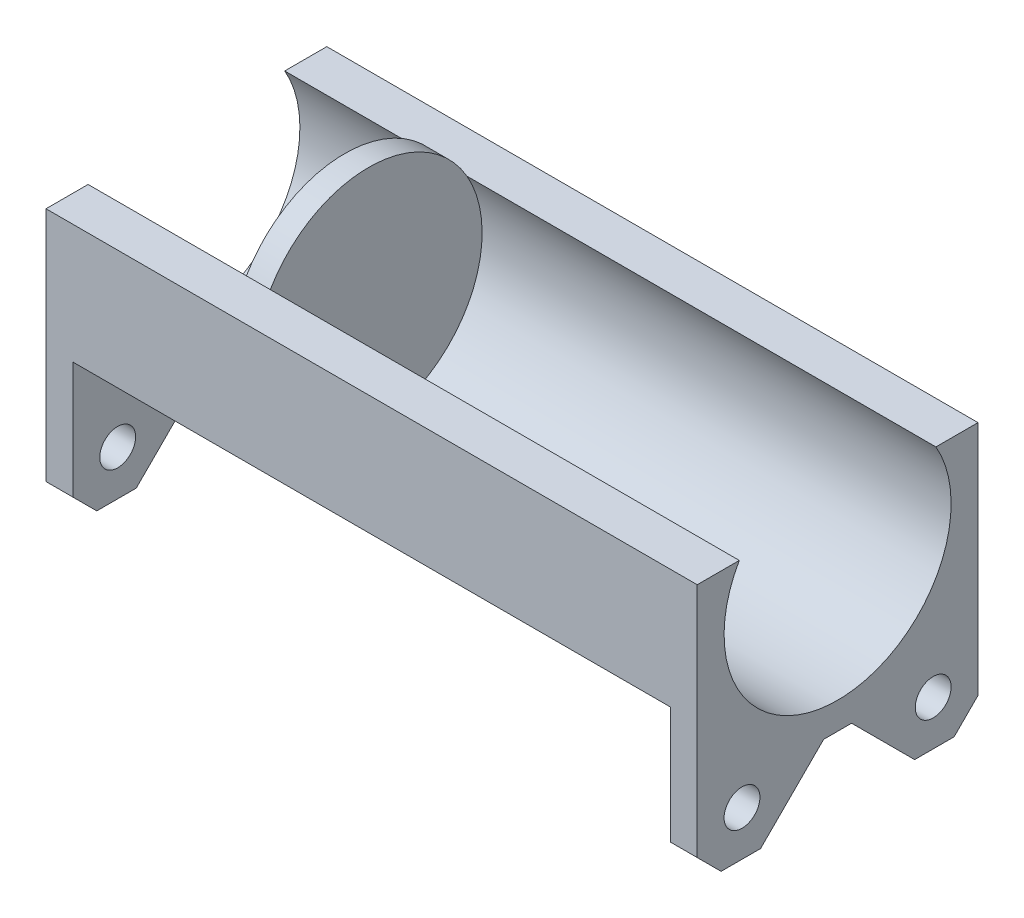
ISO-10303-21;
HEADER;
FILE_DESCRIPTION(('STEP AP214'),'2;1');
FILE_NAME('part.step','',(''),(''),'','','');
FILE_SCHEMA(('AUTOMOTIVE_DESIGN { 1 0 10303 214 1 1 1 1 }'));
ENDSEC;
DATA;
#1=APPLICATION_CONTEXT('core data for automotive mechanical design processes');
#2=APPLICATION_PROTOCOL_DEFINITION('international standard','automotive_design',2000,#1);
#3=PRODUCT_CONTEXT('',#1,'mechanical');
#4=PRODUCT('Part','Part','',(#3));
#5=PRODUCT_RELATED_PRODUCT_CATEGORY('part','',(#4));
#6=PRODUCT_DEFINITION_FORMATION('','',#4);
#7=PRODUCT_DEFINITION_CONTEXT('part definition',#1,'design');
#8=PRODUCT_DEFINITION('design','',#6,#7);
#9=PRODUCT_DEFINITION_SHAPE('','',#8);
#10=(LENGTH_UNIT() NAMED_UNIT(*) SI_UNIT(.MILLI.,.METRE.));
#11=(NAMED_UNIT(*) PLANE_ANGLE_UNIT() SI_UNIT($,.RADIAN.));
#12=(NAMED_UNIT(*) SI_UNIT($,.STERADIAN.) SOLID_ANGLE_UNIT());
#13=UNCERTAINTY_MEASURE_WITH_UNIT(LENGTH_MEASURE(1.E-05),#10,'distance_accuracy_value','');
#14=(GEOMETRIC_REPRESENTATION_CONTEXT(3) GLOBAL_UNCERTAINTY_ASSIGNED_CONTEXT((#13)) GLOBAL_UNIT_ASSIGNED_CONTEXT((#10,
#11,#12)) REPRESENTATION_CONTEXT('',''));
#15=CARTESIAN_POINT('',(0.,0.,0.));
#16=DIRECTION('',(0.,0.,1.));
#17=DIRECTION('',(1.,0.,0.));
#18=AXIS2_PLACEMENT_3D('',#15,#16,#17);
#19=CARTESIAN_POINT('',(54.5,9.50000000000002,23.5));
#20=DIRECTION('',(0.,0.,-1.));
#21=DIRECTION('',(0.,1.,0.));
#22=AXIS2_PLACEMENT_3D('',#19,#20,#21);
#23=PLANE('',#22);
#24=DIRECTION('',(0.,-1.,0.));
#25=VECTOR('',#24,1.);
#26=CARTESIAN_POINT('',(50.,-10.4680341908817,23.5));
#27=LINE('',#26,#25);
#28=CARTESIAN_POINT('',(50.,-10.4680341908817,23.5));
#29=VERTEX_POINT('',#28);
#30=CARTESIAN_POINT('',(50.,-30.0518360947035,23.5));
#31=VERTEX_POINT('',#30);
#32=EDGE_CURVE('E265',#29,#31,#27,.T.);
#33=ORIENTED_EDGE('',*,*,#32,.T.);
#34=DIRECTION('',(1.,0.,0.));
#35=VECTOR('',#34,1.);
#36=CARTESIAN_POINT('',(54.5,-30.0518360947035,23.5));
#37=LINE('',#36,#35);
#38=CARTESIAN_POINT('',(54.5,-30.0518360947035,23.5));
#39=VERTEX_POINT('',#38);
#40=EDGE_CURVE('E486',#31,#39,#37,.T.);
#41=ORIENTED_EDGE('',*,*,#40,.T.);
#42=DIRECTION('',(0.,-1.,0.));
#43=VECTOR('',#42,1.);
#44=CARTESIAN_POINT('',(54.5,9.50000000000002,23.5));
#45=LINE('',#44,#43);
#46=CARTESIAN_POINT('',(54.5,9.50000000000002,23.5));
#47=VERTEX_POINT('',#46);
#48=EDGE_CURVE('E340',#47,#39,#45,.T.);
#49=ORIENTED_EDGE('',*,*,#48,.F.);
#50=DIRECTION('',(-1.,0.,0.));
#51=VECTOR('',#50,1.);
#52=CARTESIAN_POINT('',(54.5,9.50000000000002,23.5));
#53=LINE('',#52,#51);
#54=CARTESIAN_POINT('',(-54.5,9.50000000000002,23.5));
#55=VERTEX_POINT('',#54);
#56=EDGE_CURVE('E428',#47,#55,#53,.T.);
#57=ORIENTED_EDGE('',*,*,#56,.T.);
#58=DIRECTION('',(0.,-1.,0.));
#59=VECTOR('',#58,1.);
#60=CARTESIAN_POINT('',(-54.5,9.50000000000002,23.5));
#61=LINE('',#60,#59);
#62=CARTESIAN_POINT('',(-54.5,-30.0518360947035,23.5));
#63=VERTEX_POINT('',#62);
#64=EDGE_CURVE('E373',#55,#63,#61,.T.);
#65=ORIENTED_EDGE('',*,*,#64,.T.);
#66=DIRECTION('',(1.,0.,0.));
#67=VECTOR('',#66,1.);
#68=CARTESIAN_POINT('',(54.5,-30.0518360947035,23.5));
#69=LINE('',#68,#67);
#70=CARTESIAN_POINT('',(-50.,-30.0518360947035,23.5));
#71=VERTEX_POINT('',#70);
#72=EDGE_CURVE('E483',#63,#71,#69,.T.);
#73=ORIENTED_EDGE('',*,*,#72,.T.);
#74=DIRECTION('',(0.,-1.,0.));
#75=VECTOR('',#74,1.);
#76=CARTESIAN_POINT('',(-50.,-10.4680341908817,23.5));
#77=LINE('',#76,#75);
#78=CARTESIAN_POINT('',(-50.,-10.4680341908817,23.5));
#79=VERTEX_POINT('',#78);
#80=EDGE_CURVE('E246',#79,#71,#77,.T.);
#81=ORIENTED_EDGE('',*,*,#80,.F.);
#82=DIRECTION('',(1.,0.,0.));
#83=VECTOR('',#82,1.);
#84=CARTESIAN_POINT('',(-50.,-10.4680341908817,23.5));
#85=LINE('',#84,#83);
#86=EDGE_CURVE('E240',#79,#29,#85,.T.);
#87=ORIENTED_EDGE('',*,*,#86,.T.);
#88=EDGE_LOOP('',(#33,#41,#49,#57,#65,#73,#81,#87));
#89=FACE_BOUND('',#88,.T.);
#90=ADVANCED_FACE('F41',(#89),#23,.F.);
#91=CARTESIAN_POINT('',(54.5,-34.0518360947035,23.5));
#92=DIRECTION('',(0.,1.,0.));
#93=DIRECTION('',(0.,0.,1.));
#94=AXIS2_PLACEMENT_3D('',#91,#92,#93);
#95=PLANE('',#94);
#96=DIRECTION('',(0.,0.,-1.));
#97=VECTOR('',#96,1.);
#98=CARTESIAN_POINT('',(-50.,-34.0518360947035,23.5));
#99=LINE('',#98,#97);
#100=CARTESIAN_POINT('',(-50.,-34.0518360947035,19.5));
#101=VERTEX_POINT('',#100);
#102=CARTESIAN_POINT('',(-50.,-34.0518360947035,12.8933982822018));
#103=VERTEX_POINT('',#102);
#104=EDGE_CURVE('E253',#101,#103,#99,.T.);
#105=ORIENTED_EDGE('',*,*,#104,.F.);
#106=DIRECTION('',(-1.,0.,0.));
#107=VECTOR('',#106,1.);
#108=CARTESIAN_POINT('',(54.5,-34.0518360947035,19.5));
#109=LINE('',#108,#107);
#110=CARTESIAN_POINT('',(-54.5,-34.0518360947035,19.5));
#111=VERTEX_POINT('',#110);
#112=EDGE_CURVE('E489',#101,#111,#109,.T.);
#113=ORIENTED_EDGE('',*,*,#112,.T.);
#114=DIRECTION('',(0.,0.,-1.));
#115=VECTOR('',#114,1.);
#116=CARTESIAN_POINT('',(-54.5,-34.0518360947035,23.5));
#117=LINE('',#116,#115);
#118=CARTESIAN_POINT('',(-54.5,-34.0518360947035,12.8933982822018));
#119=VERTEX_POINT('',#118);
#120=EDGE_CURVE('E377',#111,#119,#117,.T.);
#121=ORIENTED_EDGE('',*,*,#120,.T.);
#122=DIRECTION('',(-1.,0.,0.));
#123=VECTOR('',#122,1.);
#124=CARTESIAN_POINT('',(54.5,-34.0518360947035,12.8933982822018));
#125=LINE('',#124,#123);
#126=EDGE_CURVE('E423',#103,#119,#125,.T.);
#127=ORIENTED_EDGE('',*,*,#126,.F.);
#128=EDGE_LOOP('',(#105,#113,#121,#127));
#129=FACE_BOUND('',#128,.T.);
#130=ADVANCED_FACE('F586',(#129),#95,.F.);
#131=CARTESIAN_POINT('',(54.5,-34.0518360947035,12.8933982822018));
#132=DIRECTION('',(0.,0.707106781186546,0.707106781186549));
#133=DIRECTION('',(0.,-0.707106781186549,0.707106781186546));
#134=AXIS2_PLACEMENT_3D('',#131,#132,#133);
#135=PLANE('',#134);
#136=DIRECTION('',(0.,0.707106781186549,-0.707106781186546));
#137=VECTOR('',#136,1.);
#138=CARTESIAN_POINT('',(-50.,-34.0518360947035,12.8933982822018));
#139=LINE('',#138,#137);
#140=CARTESIAN_POINT('',(-50.,-23.5,2.3415621874983));
#141=VERTEX_POINT('',#140);
#142=EDGE_CURVE('E224',#103,#141,#139,.T.);
#143=ORIENTED_EDGE('',*,*,#142,.F.);
#144=ORIENTED_EDGE('',*,*,#126,.T.);
#145=DIRECTION('',(0.,0.707106781186549,-0.707106781186546));
#146=VECTOR('',#145,1.);
#147=CARTESIAN_POINT('',(-54.5,-34.0518360947035,12.8933982822018));
#148=LINE('',#147,#146);
#149=CARTESIAN_POINT('',(-54.5,-23.5,2.3415621874983));
#150=VERTEX_POINT('',#149);
#151=EDGE_CURVE('E380',#119,#150,#148,.T.);
#152=ORIENTED_EDGE('',*,*,#151,.T.);
#153=DIRECTION('',(-1.,0.,0.));
#154=VECTOR('',#153,1.);
#155=CARTESIAN_POINT('',(54.5,-23.5,2.3415621874983));
#156=LINE('',#155,#154);
#157=EDGE_CURVE('E419',#141,#150,#156,.T.);
#158=ORIENTED_EDGE('',*,*,#157,.F.);
#159=EDGE_LOOP('',(#143,#144,#152,#158));
#160=FACE_BOUND('',#159,.T.);
#161=ADVANCED_FACE('F582',(#160),#135,.F.);
#162=CARTESIAN_POINT('',(54.5,-34.0518360947035,-12.8933982822018));
#163=DIRECTION('',(0.,0.707106781186546,-0.707106781186549));
#164=DIRECTION('',(0.,0.707106781186549,0.707106781186546));
#165=AXIS2_PLACEMENT_3D('',#162,#163,#164);
#166=PLANE('',#165);
#167=DIRECTION('',(0.,-0.707106781186549,-0.707106781186546));
#168=VECTOR('',#167,1.);
#169=CARTESIAN_POINT('',(-50.,-34.0518360947035,-12.8933982822018));
#170=LINE('',#169,#168);
#171=CARTESIAN_POINT('',(-50.,-23.5,-2.3415621874983));
#172=VERTEX_POINT('',#171);
#173=CARTESIAN_POINT('',(-50.,-34.0518360947035,-12.8933982822018));
#174=VERTEX_POINT('',#173);
#175=EDGE_CURVE('E310',#172,#174,#170,.T.);
#176=ORIENTED_EDGE('',*,*,#175,.F.);
#177=DIRECTION('',(-1.,0.,0.));
#178=VECTOR('',#177,1.);
#179=CARTESIAN_POINT('',(54.5,-23.5,-2.3415621874983));
#180=LINE('',#179,#178);
#181=CARTESIAN_POINT('',(-54.5,-23.5,-2.3415621874983));
#182=VERTEX_POINT('',#181);
#183=EDGE_CURVE('E414',#172,#182,#180,.T.);
#184=ORIENTED_EDGE('',*,*,#183,.T.);
#185=DIRECTION('',(0.,-0.707106781186549,-0.707106781186546));
#186=VECTOR('',#185,1.);
#187=CARTESIAN_POINT('',(-54.5,-34.0518360947035,-12.8933982822018));
#188=LINE('',#187,#186);
#189=CARTESIAN_POINT('',(-54.5,-34.0518360947035,-12.8933982822018));
#190=VERTEX_POINT('',#189);
#191=EDGE_CURVE('E388',#182,#190,#188,.T.);
#192=ORIENTED_EDGE('',*,*,#191,.T.);
#193=DIRECTION('',(-1.,0.,0.));
#194=VECTOR('',#193,1.);
#195=CARTESIAN_POINT('',(54.5,-34.0518360947035,-12.8933982822018));
#196=LINE('',#195,#194);
#197=EDGE_CURVE('E409',#174,#190,#196,.T.);
#198=ORIENTED_EDGE('',*,*,#197,.F.);
#199=EDGE_LOOP('',(#176,#184,#192,#198));
#200=FACE_BOUND('',#199,.T.);
#201=ADVANCED_FACE('F569',(#200),#166,.F.);
#202=CARTESIAN_POINT('',(54.5,-34.0518360947035,-23.5));
#203=DIRECTION('',(0.,1.,0.));
#204=DIRECTION('',(0.,0.,1.));
#205=AXIS2_PLACEMENT_3D('',#202,#203,#204);
#206=PLANE('',#205);
#207=DIRECTION('',(0.,0.,-1.));
#208=VECTOR('',#207,1.);
#209=CARTESIAN_POINT('',(-54.5,-34.0518360947035,-23.5));
#210=LINE('',#209,#208);
#211=CARTESIAN_POINT('',(-54.5,-34.0518360947035,-19.5));
#212=VERTEX_POINT('',#211);
#213=EDGE_CURVE('E392',#190,#212,#210,.T.);
#214=ORIENTED_EDGE('',*,*,#213,.T.);
#215=DIRECTION('',(1.,0.,0.));
#216=VECTOR('',#215,1.);
#217=CARTESIAN_POINT('',(54.5,-34.0518360947035,-19.5));
#218=LINE('',#217,#216);
#219=CARTESIAN_POINT('',(-50.,-34.0518360947035,-19.5));
#220=VERTEX_POINT('',#219);
#221=EDGE_CURVE('E51',#212,#220,#218,.T.);
#222=ORIENTED_EDGE('',*,*,#221,.T.);
#223=EDGE_CURVE('E250',#174,#220,#99,.T.);
#224=ORIENTED_EDGE('',*,*,#223,.F.);
#225=ORIENTED_EDGE('',*,*,#197,.T.);
#226=EDGE_LOOP('',(#214,#222,#224,#225));
#227=FACE_BOUND('',#226,.T.);
#228=ADVANCED_FACE('F573',(#227),#206,.F.);
#229=CARTESIAN_POINT('',(54.5,9.50000000000002,-23.5));
#230=DIRECTION('',(0.,0.,1.));
#231=DIRECTION('',(0.,-1.,0.));
#232=AXIS2_PLACEMENT_3D('',#229,#230,#231);
#233=PLANE('',#232);
#234=DIRECTION('',(0.,1.,0.));
#235=VECTOR('',#234,1.);
#236=CARTESIAN_POINT('',(54.5,9.50000000000002,-23.5));
#237=LINE('',#236,#235);
#238=CARTESIAN_POINT('',(54.5,-30.0518360947035,-23.5));
#239=VERTEX_POINT('',#238);
#240=CARTESIAN_POINT('',(54.5,9.50000000000002,-23.5));
#241=VERTEX_POINT('',#240);
#242=EDGE_CURVE('E360',#239,#241,#237,.T.);
#243=ORIENTED_EDGE('',*,*,#242,.F.);
#244=DIRECTION('',(-1.,0.,0.));
#245=VECTOR('',#244,1.);
#246=CARTESIAN_POINT('',(54.5,-30.0518360947035,-23.5));
#247=LINE('',#246,#245);
#248=CARTESIAN_POINT('',(50.,-30.0518360947035,-23.5));
#249=VERTEX_POINT('',#248);
#250=EDGE_CURVE('E460',#239,#249,#247,.T.);
#251=ORIENTED_EDGE('',*,*,#250,.T.);
#252=DIRECTION('',(0.,1.,0.));
#253=VECTOR('',#252,1.);
#254=CARTESIAN_POINT('',(50.,-34.0518360947035,-23.5));
#255=LINE('',#254,#253);
#256=CARTESIAN_POINT('',(50.,-10.4680341908817,-23.5));
#257=VERTEX_POINT('',#256);
#258=EDGE_CURVE('E273',#249,#257,#255,.T.);
#259=ORIENTED_EDGE('',*,*,#258,.T.);
#260=DIRECTION('',(1.,0.,0.));
#261=VECTOR('',#260,1.);
#262=CARTESIAN_POINT('',(-50.,-10.4680341908818,-23.5));
#263=LINE('',#262,#261);
#264=CARTESIAN_POINT('',(-50.,-10.4680341908818,-23.5));
#265=VERTEX_POINT('',#264);
#266=EDGE_CURVE('E287',#265,#257,#263,.T.);
#267=ORIENTED_EDGE('',*,*,#266,.F.);
#268=DIRECTION('',(0.,1.,0.));
#269=VECTOR('',#268,1.);
#270=CARTESIAN_POINT('',(-50.,-34.0518360947035,-23.5));
#271=LINE('',#270,#269);
#272=CARTESIAN_POINT('',(-50.,-30.0518360947035,-23.5));
#273=VERTEX_POINT('',#272);
#274=EDGE_CURVE('E256',#273,#265,#271,.T.);
#275=ORIENTED_EDGE('',*,*,#274,.F.);
#276=DIRECTION('',(-1.,0.,0.));
#277=VECTOR('',#276,1.);
#278=CARTESIAN_POINT('',(54.5,-30.0518360947035,-23.5));
#279=LINE('',#278,#277);
#280=CARTESIAN_POINT('',(-54.5,-30.0518360947035,-23.5));
#281=VERTEX_POINT('',#280);
#282=EDGE_CURVE('E446',#273,#281,#279,.T.);
#283=ORIENTED_EDGE('',*,*,#282,.T.);
#284=DIRECTION('',(0.,1.,0.));
#285=VECTOR('',#284,1.);
#286=CARTESIAN_POINT('',(-54.5,9.50000000000002,-23.5));
#287=LINE('',#286,#285);
#288=CARTESIAN_POINT('',(-54.5,9.50000000000002,-23.5));
#289=VERTEX_POINT('',#288);
#290=EDGE_CURVE('E395',#281,#289,#287,.T.);
#291=ORIENTED_EDGE('',*,*,#290,.T.);
#292=DIRECTION('',(-1.,0.,0.));
#293=VECTOR('',#292,1.);
#294=CARTESIAN_POINT('',(54.5,9.50000000000002,-23.5));
#295=LINE('',#294,#293);
#296=EDGE_CURVE('E404',#241,#289,#295,.T.);
#297=ORIENTED_EDGE('',*,*,#296,.F.);
#298=EDGE_LOOP('',(#243,#251,#259,#267,#275,#283,#291,#297));
#299=FACE_BOUND('',#298,.T.);
#300=ADVANCED_FACE('F525',(#299),#233,.F.);
#301=CARTESIAN_POINT('',(54.5,-26.5518360947035,-16.));
#302=DIRECTION('',(-1.,0.,0.));
#303=DIRECTION('',(0.,0.,1.));
#304=AXIS2_PLACEMENT_3D('',#301,#302,#303);
#305=CYLINDRICAL_SURFACE('',#304,3.);
#306=CARTESIAN_POINT('',(-54.5,-26.5518360947035,-16.));
#307=DIRECTION('',(1.,0.,0.));
#308=DIRECTION('',(0.,0.,-1.));
#309=AXIS2_PLACEMENT_3D('',#306,#307,#308);
#310=CIRCLE('',#309,3.);
#311=CARTESIAN_POINT('',(-54.5,-26.5518360947035,-19.));
#312=VERTEX_POINT('',#311);
#313=EDGE_CURVE('E320',#312,#312,#310,.T.);
#314=ORIENTED_EDGE('',*,*,#313,.F.);
#315=EDGE_LOOP('',(#314));
#316=FACE_BOUND('',#315,.T.);
#317=CARTESIAN_POINT('',(-50.,-26.5518360947035,-16.));
#318=DIRECTION('',(1.,0.,0.));
#319=DIRECTION('',(0.,0.,-1.));
#320=AXIS2_PLACEMENT_3D('',#317,#318,#319);
#321=CIRCLE('',#320,3.);
#322=CARTESIAN_POINT('',(-50.,-26.5518360947035,-19.));
#323=VERTEX_POINT('',#322);
#324=EDGE_CURVE('E306',#323,#323,#321,.T.);
#325=ORIENTED_EDGE('',*,*,#324,.T.);
#326=EDGE_LOOP('',(#325));
#327=FACE_BOUND('',#326,.T.);
#328=ADVANCED_FACE('F580',(#316,#327),#305,.F.);
#329=CARTESIAN_POINT('',(54.5,-26.5518360947035,16.));
#330=DIRECTION('',(-1.,0.,0.));
#331=DIRECTION('',(0.,0.,1.));
#332=AXIS2_PLACEMENT_3D('',#329,#330,#331);
#333=CYLINDRICAL_SURFACE('',#332,3.);
#334=CARTESIAN_POINT('',(-54.5,-26.5518360947035,16.));
#335=DIRECTION('',(1.,0.,0.));
#336=DIRECTION('',(0.,0.,1.));
#337=AXIS2_PLACEMENT_3D('',#334,#335,#336);
#338=CIRCLE('',#337,3.);
#339=CARTESIAN_POINT('',(-54.5,-26.5518360947035,19.));
#340=VERTEX_POINT('',#339);
#341=EDGE_CURVE('E315',#340,#340,#338,.T.);
#342=ORIENTED_EDGE('',*,*,#341,.F.);
#343=EDGE_LOOP('',(#342));
#344=FACE_BOUND('',#343,.T.);
#345=CARTESIAN_POINT('',(-50.,-26.5518360947035,16.));
#346=DIRECTION('',(1.,0.,0.));
#347=DIRECTION('',(0.,0.,-1.));
#348=AXIS2_PLACEMENT_3D('',#345,#346,#347);
#349=CIRCLE('',#348,3.);
#350=CARTESIAN_POINT('',(-50.,-26.5518360947035,13.));
#351=VERTEX_POINT('',#350);
#352=EDGE_CURVE('E305',#351,#351,#349,.T.);
#353=ORIENTED_EDGE('',*,*,#352,.T.);
#354=EDGE_LOOP('',(#353));
#355=FACE_BOUND('',#354,.T.);
#356=ADVANCED_FACE('F617',(#344,#355),#333,.F.);
#357=CARTESIAN_POINT('',(-28.,0.,0.));
#358=DIRECTION('',(1.,0.,0.));
#359=DIRECTION('',(0.,0.,-1.));
#360=AXIS2_PLACEMENT_3D('',#357,#358,#359);
#361=CYLINDRICAL_SURFACE('',#360,19.);
#362=CARTESIAN_POINT('',(-28.,0.,0.));
#363=DIRECTION('',(1.,0.,0.));
#364=DIRECTION('',(0.,0.,-1.));
#365=AXIS2_PLACEMENT_3D('',#362,#363,#364);
#366=CIRCLE('',#365,19.);
#367=CARTESIAN_POINT('',(-28.,9.50000000000002,-16.4544826719043));
#368=VERTEX_POINT('',#367);
#369=CARTESIAN_POINT('',(-28.,9.4999999999999,16.4544826719044));
#370=VERTEX_POINT('',#369);
#371=EDGE_CURVE('E442',#368,#370,#366,.T.);
#372=ORIENTED_EDGE('',*,*,#371,.T.);
#373=DIRECTION('',(-1.,0.,0.));
#374=VECTOR('',#373,1.);
#375=CARTESIAN_POINT('',(54.5,9.4999999999999,16.4544826719044));
#376=LINE('',#375,#374);
#377=CARTESIAN_POINT('',(-24.,9.4999999999999,16.4544826719044));
#378=VERTEX_POINT('',#377);
#379=EDGE_CURVE('E438',#378,#370,#376,.T.);
#380=ORIENTED_EDGE('',*,*,#379,.F.);
#381=CARTESIAN_POINT('',(-24.,0.,0.));
#382=DIRECTION('',(1.,0.,0.));
#383=DIRECTION('',(0.,0.,-1.));
#384=AXIS2_PLACEMENT_3D('',#381,#382,#383);
#385=CIRCLE('',#384,19.);
#386=CARTESIAN_POINT('',(-24.,9.50000000000002,-16.4544826719043));
#387=VERTEX_POINT('',#386);
#388=EDGE_CURVE('E447',#387,#378,#385,.T.);
#389=ORIENTED_EDGE('',*,*,#388,.F.);
#390=DIRECTION('',(-1.,0.,0.));
#391=VECTOR('',#390,1.);
#392=CARTESIAN_POINT('',(54.5,9.50000000000002,-16.4544826719043));
#393=LINE('',#392,#391);
#394=EDGE_CURVE('E405',#387,#368,#393,.T.);
#395=ORIENTED_EDGE('',*,*,#394,.T.);
#396=EDGE_LOOP('',(#372,#380,#389,#395));
#397=FACE_BOUND('',#396,.T.);
#398=ADVANCED_FACE('F610',(#397),#361,.T.);
#399=CARTESIAN_POINT('',(-28.,0.,0.));
#400=DIRECTION('',(1.,0.,0.));
#401=DIRECTION('',(0.,0.,-1.));
#402=AXIS2_PLACEMENT_3D('',#399,#400,#401);
#403=PLANE('',#402);
#404=ORIENTED_EDGE('',*,*,#371,.F.);
#405=CARTESIAN_POINT('',(-28.,0.,0.));
#406=DIRECTION('',(1.,0.,0.));
#407=DIRECTION('',(0.,0.,-1.));
#408=AXIS2_PLACEMENT_3D('',#405,#406,#407);
#409=CIRCLE('',#408,19.);
#410=EDGE_CURVE('E437',#370,#368,#409,.T.);
#411=ORIENTED_EDGE('',*,*,#410,.F.);
#412=EDGE_LOOP('',(#404,#411));
#413=FACE_BOUND('',#412,.T.);
#414=ADVANCED_FACE('F606',(#413),#403,.F.);
#415=CARTESIAN_POINT('',(-24.,0.,0.));
#416=DIRECTION('',(1.,0.,0.));
#417=DIRECTION('',(0.,0.,-1.));
#418=AXIS2_PLACEMENT_3D('',#415,#416,#417);
#419=PLANE('',#418);
#420=ORIENTED_EDGE('',*,*,#388,.T.);
#421=EDGE_CURVE('E441',#378,#387,#385,.T.);
#422=ORIENTED_EDGE('',*,*,#421,.T.);
#423=EDGE_LOOP('',(#420,#422));
#424=FACE_BOUND('',#423,.T.);
#425=ADVANCED_FACE('F609',(#424),#419,.T.);
#426=CARTESIAN_POINT('',(54.5,0.,0.));
#427=DIRECTION('',(-1.,0.,0.));
#428=DIRECTION('',(0.,0.,1.));
#429=AXIS2_PLACEMENT_3D('',#426,#427,#428);
#430=CYLINDRICAL_SURFACE('',#429,19.);
#431=CARTESIAN_POINT('',(-54.5,9.4999999999999,16.4544826719044));
#432=VERTEX_POINT('',#431);
#433=EDGE_CURVE('E432',#370,#432,#376,.T.);
#434=ORIENTED_EDGE('',*,*,#433,.F.);
#435=ORIENTED_EDGE('',*,*,#410,.T.);
#436=CARTESIAN_POINT('',(-54.5,9.50000000000002,-16.4544826719043));
#437=VERTEX_POINT('',#436);
#438=EDGE_CURVE('E366',#368,#437,#393,.T.);
#439=ORIENTED_EDGE('',*,*,#438,.T.);
#440=CARTESIAN_POINT('',(-54.5,0.,0.));
#441=DIRECTION('',(-1.,0.,0.));
#442=DIRECTION('',(0.,0.,-1.));
#443=AXIS2_PLACEMENT_3D('',#440,#441,#442);
#444=CIRCLE('',#443,19.);
#445=EDGE_CURVE('E328',#437,#432,#444,.T.);
#446=ORIENTED_EDGE('',*,*,#445,.T.);
#447=EDGE_LOOP('',(#434,#435,#439,#446));
#448=FACE_BOUND('',#447,.T.);
#449=ADVANCED_FACE('F605',(#448),#430,.F.);
#450=CARTESIAN_POINT('',(54.5,0.,0.));
#451=DIRECTION('',(1.,0.,0.));
#452=DIRECTION('',(0.,0.,-1.));
#453=AXIS2_PLACEMENT_3D('',#450,#451,#452);
#454=PLANE('',#453);
#455=CARTESIAN_POINT('',(54.5,-26.5518360947035,-16.));
#456=DIRECTION('',(1.,0.,0.));
#457=DIRECTION('',(0.,0.,-1.));
#458=AXIS2_PLACEMENT_3D('',#455,#456,#457);
#459=CIRCLE('',#458,3.);
#460=CARTESIAN_POINT('',(54.5,-26.5518360947035,-19.));
#461=VERTEX_POINT('',#460);
#462=EDGE_CURVE('E324',#461,#461,#459,.T.);
#463=ORIENTED_EDGE('',*,*,#462,.F.);
#464=EDGE_LOOP('',(#463));
#465=FACE_BOUND('',#464,.T.);
#466=DIRECTION('',(0.,0.,-1.));
#467=VECTOR('',#466,1.);
#468=CARTESIAN_POINT('',(54.5,-34.0518360947035,-23.5));
#469=LINE('',#468,#467);
#470=CARTESIAN_POINT('',(54.5,-34.0518360947035,-12.8933982822018));
#471=VERTEX_POINT('',#470);
#472=CARTESIAN_POINT('',(54.5,-34.0518360947035,-19.5));
#473=VERTEX_POINT('',#472);
#474=EDGE_CURVE('E356',#471,#473,#469,.T.);
#475=ORIENTED_EDGE('',*,*,#474,.T.);
#476=DIRECTION('',(0.,-0.707106781186547,0.707106781186548));
#477=VECTOR('',#476,1.);
#478=CARTESIAN_POINT('',(54.5,-26.7759180473518,-26.7759180473517));
#479=LINE('',#478,#477);
#480=EDGE_CURVE('E473',#473,#239,#479,.F.);
#481=ORIENTED_EDGE('',*,*,#480,.T.);
#482=ORIENTED_EDGE('',*,*,#242,.T.);
#483=DIRECTION('',(0.,0.,1.));
#484=VECTOR('',#483,1.);
#485=CARTESIAN_POINT('',(54.5,9.50000000000002,-16.4544826719043));
#486=LINE('',#485,#484);
#487=CARTESIAN_POINT('',(54.5,9.50000000000002,-16.4544826719043));
#488=VERTEX_POINT('',#487);
#489=EDGE_CURVE('E363',#241,#488,#486,.T.);
#490=ORIENTED_EDGE('',*,*,#489,.T.);
#491=CARTESIAN_POINT('',(54.5,0.,0.));
#492=DIRECTION('',(-1.,0.,0.));
#493=DIRECTION('',(0.,0.,-1.));
#494=AXIS2_PLACEMENT_3D('',#491,#492,#493);
#495=CIRCLE('',#494,19.);
#496=CARTESIAN_POINT('',(54.5,9.4999999999999,16.4544826719044));
#497=VERTEX_POINT('',#496);
#498=EDGE_CURVE('E332',#488,#497,#495,.T.);
#499=ORIENTED_EDGE('',*,*,#498,.T.);
#500=DIRECTION('',(0.,0.,1.));
#501=VECTOR('',#500,1.);
#502=CARTESIAN_POINT('',(54.5,9.4999999999999,16.4544826719044));
#503=LINE('',#502,#501);
#504=EDGE_CURVE('E336',#497,#47,#503,.T.);
#505=ORIENTED_EDGE('',*,*,#504,.T.);
#506=ORIENTED_EDGE('',*,*,#48,.T.);
#507=DIRECTION('',(0.,0.707106781186547,0.707106781186548));
#508=VECTOR('',#507,1.);
#509=CARTESIAN_POINT('',(54.5,-26.7759180473518,26.7759180473517));
#510=LINE('',#509,#508);
#511=CARTESIAN_POINT('',(54.5,-34.0518360947035,19.5));
#512=VERTEX_POINT('',#511);
#513=EDGE_CURVE('E470',#39,#512,#510,.F.);
#514=ORIENTED_EDGE('',*,*,#513,.T.);
#515=DIRECTION('',(0.,0.,-1.));
#516=VECTOR('',#515,1.);
#517=CARTESIAN_POINT('',(54.5,-34.0518360947035,23.5));
#518=LINE('',#517,#516);
#519=CARTESIAN_POINT('',(54.5,-34.0518360947035,12.8933982822018));
#520=VERTEX_POINT('',#519);
#521=EDGE_CURVE('E344',#512,#520,#518,.T.);
#522=ORIENTED_EDGE('',*,*,#521,.T.);
#523=DIRECTION('',(0.,0.707106781186549,-0.707106781186546));
#524=VECTOR('',#523,1.);
#525=CARTESIAN_POINT('',(54.5,-34.0518360947035,12.8933982822018));
#526=LINE('',#525,#524);
#527=CARTESIAN_POINT('',(54.5,-23.5,2.3415621874983));
#528=VERTEX_POINT('',#527);
#529=EDGE_CURVE('E347',#520,#528,#526,.T.);
#530=ORIENTED_EDGE('',*,*,#529,.T.);
#531=DIRECTION('',(0.,0.,-1.));
#532=VECTOR('',#531,1.);
#533=CARTESIAN_POINT('',(54.5,-23.5,-2.3415621874983));
#534=LINE('',#533,#532);
#535=CARTESIAN_POINT('',(54.5,-23.5,-2.3415621874983));
#536=VERTEX_POINT('',#535);
#537=EDGE_CURVE('E350',#528,#536,#534,.T.);
#538=ORIENTED_EDGE('',*,*,#537,.T.);
#539=DIRECTION('',(0.,-0.707106781186549,-0.707106781186546));
#540=VECTOR('',#539,1.);
#541=CARTESIAN_POINT('',(54.5,-34.0518360947035,-12.8933982822018));
#542=LINE('',#541,#540);
#543=EDGE_CURVE('E353',#536,#471,#542,.T.);
#544=ORIENTED_EDGE('',*,*,#543,.T.);
#545=EDGE_LOOP('',(#475,#481,#482,#490,#499,#505,#506,#514,#522,#530,#538,#544));
#546=FACE_BOUND('',#545,.T.);
#547=CARTESIAN_POINT('',(54.5,-26.5518360947035,16.));
#548=DIRECTION('',(1.,0.,0.));
#549=DIRECTION('',(0.,0.,1.));
#550=AXIS2_PLACEMENT_3D('',#547,#548,#549);
#551=CIRCLE('',#550,3.);
#552=CARTESIAN_POINT('',(54.5,-26.5518360947035,19.));
#553=VERTEX_POINT('',#552);
#554=EDGE_CURVE('E316',#553,#553,#551,.T.);
#555=ORIENTED_EDGE('',*,*,#554,.F.);
#556=EDGE_LOOP('',(#555));
#557=FACE_BOUND('',#556,.T.);
#558=ADVANCED_FACE('F655',(#465,#546,#557),#454,.T.);
#559=CARTESIAN_POINT('',(-54.5,0.,0.));
#560=DIRECTION('',(1.,0.,0.));
#561=DIRECTION('',(0.,0.,-1.));
#562=AXIS2_PLACEMENT_3D('',#559,#560,#561);
#563=PLANE('',#562);
#564=ORIENTED_EDGE('',*,*,#120,.F.);
#565=DIRECTION('',(0.,-0.707106781186547,-0.707106781186548));
#566=VECTOR('',#565,1.);
#567=CARTESIAN_POINT('',(-54.5,-34.0518360947035,19.5));
#568=LINE('',#567,#566);
#569=EDGE_CURVE('E495',#111,#63,#568,.F.);
#570=ORIENTED_EDGE('',*,*,#569,.T.);
#571=ORIENTED_EDGE('',*,*,#64,.F.);
#572=DIRECTION('',(0.,0.,1.));
#573=VECTOR('',#572,1.);
#574=CARTESIAN_POINT('',(-54.5,9.4999999999999,16.4544826719044));
#575=LINE('',#574,#573);
#576=EDGE_CURVE('E370',#432,#55,#575,.T.);
#577=ORIENTED_EDGE('',*,*,#576,.F.);
#578=ORIENTED_EDGE('',*,*,#445,.F.);
#579=DIRECTION('',(0.,0.,1.));
#580=VECTOR('',#579,1.);
#581=CARTESIAN_POINT('',(-54.5,9.50000000000002,-16.4544826719043));
#582=LINE('',#581,#580);
#583=EDGE_CURVE('E337',#289,#437,#582,.T.);
#584=ORIENTED_EDGE('',*,*,#583,.F.);
#585=ORIENTED_EDGE('',*,*,#290,.F.);
#586=DIRECTION('',(0.,0.707106781186547,-0.707106781186548));
#587=VECTOR('',#586,1.);
#588=CARTESIAN_POINT('',(-54.5,-30.0518360947035,-23.5));
#589=LINE('',#588,#587);
#590=EDGE_CURVE('E65',#281,#212,#589,.F.);
#591=ORIENTED_EDGE('',*,*,#590,.T.);
#592=ORIENTED_EDGE('',*,*,#213,.F.);
#593=ORIENTED_EDGE('',*,*,#191,.F.);
#594=DIRECTION('',(0.,0.,-1.));
#595=VECTOR('',#594,1.);
#596=CARTESIAN_POINT('',(-54.5,-23.5,-2.3415621874983));
#597=LINE('',#596,#595);
#598=EDGE_CURVE('E384',#150,#182,#597,.T.);
#599=ORIENTED_EDGE('',*,*,#598,.F.);
#600=ORIENTED_EDGE('',*,*,#151,.F.);
#601=EDGE_LOOP('',(#564,#570,#571,#577,#578,#584,#585,#591,#592,#593,#599,#600));
#602=FACE_BOUND('',#601,.T.);
#603=ORIENTED_EDGE('',*,*,#313,.T.);
#604=EDGE_LOOP('',(#603));
#605=FACE_BOUND('',#604,.T.);
#606=ORIENTED_EDGE('',*,*,#341,.T.);
#607=EDGE_LOOP('',(#606));
#608=FACE_BOUND('',#607,.T.);
#609=ADVANCED_FACE('F530',(#602,#605,#608),#563,.F.);
#610=ORIENTED_EDGE('',*,*,#421,.F.);
#611=EDGE_CURVE('E433',#497,#378,#376,.T.);
#612=ORIENTED_EDGE('',*,*,#611,.F.);
#613=ORIENTED_EDGE('',*,*,#498,.F.);
#614=EDGE_CURVE('E401',#488,#387,#393,.T.);
#615=ORIENTED_EDGE('',*,*,#614,.T.);
#616=EDGE_LOOP('',(#610,#612,#613,#615));
#617=FACE_BOUND('',#616,.T.);
#618=ADVANCED_FACE('F600',(#617),#430,.F.);
#619=CARTESIAN_POINT('',(54.5,9.4999999999999,16.4544826719044));
#620=DIRECTION('',(0.,-1.,0.));
#621=DIRECTION('',(0.,0.,-1.));
#622=AXIS2_PLACEMENT_3D('',#619,#620,#621);
#623=PLANE('',#622);
#624=ORIENTED_EDGE('',*,*,#576,.T.);
#625=ORIENTED_EDGE('',*,*,#56,.F.);
#626=ORIENTED_EDGE('',*,*,#504,.F.);
#627=ORIENTED_EDGE('',*,*,#611,.T.);
#628=ORIENTED_EDGE('',*,*,#379,.T.);
#629=ORIENTED_EDGE('',*,*,#433,.T.);
#630=EDGE_LOOP('',(#624,#625,#626,#627,#628,#629));
#631=FACE_BOUND('',#630,.T.);
#632=ADVANCED_FACE('F597',(#631),#623,.F.);
#633=ORIENTED_EDGE('',*,*,#521,.F.);
#634=DIRECTION('',(-1.,0.,0.));
#635=VECTOR('',#634,1.);
#636=CARTESIAN_POINT('',(54.5,-34.0518360947035,19.5));
#637=LINE('',#636,#635);
#638=CARTESIAN_POINT('',(50.,-34.0518360947035,19.5));
#639=VERTEX_POINT('',#638);
#640=EDGE_CURVE('E476',#512,#639,#637,.T.);
#641=ORIENTED_EDGE('',*,*,#640,.T.);
#642=DIRECTION('',(0.,0.,-1.));
#643=VECTOR('',#642,1.);
#644=CARTESIAN_POINT('',(50.,-34.0518360947035,23.5));
#645=LINE('',#644,#643);
#646=CARTESIAN_POINT('',(50.,-34.0518360947035,12.8933982822018));
#647=VERTEX_POINT('',#646);
#648=EDGE_CURVE('E270',#639,#647,#645,.T.);
#649=ORIENTED_EDGE('',*,*,#648,.T.);
#650=EDGE_CURVE('E424',#520,#647,#125,.T.);
#651=ORIENTED_EDGE('',*,*,#650,.F.);
#652=EDGE_LOOP('',(#633,#641,#649,#651));
#653=FACE_BOUND('',#652,.T.);
#654=ADVANCED_FACE('F594',(#653),#95,.F.);
#655=ORIENTED_EDGE('',*,*,#650,.T.);
#656=DIRECTION('',(0.,0.707106781186549,-0.707106781186546));
#657=VECTOR('',#656,1.);
#658=CARTESIAN_POINT('',(50.,-34.0518360947035,12.8933982822018));
#659=LINE('',#658,#657);
#660=CARTESIAN_POINT('',(50.,-23.5,2.3415621874983));
#661=VERTEX_POINT('',#660);
#662=EDGE_CURVE('E301',#647,#661,#659,.T.);
#663=ORIENTED_EDGE('',*,*,#662,.T.);
#664=EDGE_CURVE('E420',#528,#661,#156,.T.);
#665=ORIENTED_EDGE('',*,*,#664,.F.);
#666=ORIENTED_EDGE('',*,*,#529,.F.);
#667=EDGE_LOOP('',(#655,#663,#665,#666));
#668=FACE_BOUND('',#667,.T.);
#669=ADVANCED_FACE('F670',(#668),#135,.F.);
#670=CARTESIAN_POINT('',(54.5,-23.5,-2.3415621874983));
#671=DIRECTION('',(0.,1.,0.));
#672=DIRECTION('',(0.,0.,1.));
#673=AXIS2_PLACEMENT_3D('',#670,#671,#672);
#674=PLANE('',#673);
#675=ORIENTED_EDGE('',*,*,#664,.T.);
#676=DIRECTION('',(0.,0.,1.));
#677=VECTOR('',#676,1.);
#678=CARTESIAN_POINT('',(50.,-23.5,-2.3415621874983));
#679=LINE('',#678,#677);
#680=CARTESIAN_POINT('',(50.,-23.5,7.9691079284185));
#681=VERTEX_POINT('',#680);
#682=EDGE_CURVE('E235',#661,#681,#679,.T.);
#683=ORIENTED_EDGE('',*,*,#682,.T.);
#684=DIRECTION('',(1.,0.,0.));
#685=VECTOR('',#684,1.);
#686=CARTESIAN_POINT('',(-50.,-23.5,7.9691079284185));
#687=LINE('',#686,#685);
#688=CARTESIAN_POINT('',(-50.,-23.5,7.9691079284185));
#689=VERTEX_POINT('',#688);
#690=EDGE_CURVE('E232',#689,#681,#687,.T.);
#691=ORIENTED_EDGE('',*,*,#690,.F.);
#692=DIRECTION('',(0.,0.,1.));
#693=VECTOR('',#692,1.);
#694=CARTESIAN_POINT('',(-50.,-23.5,-2.3415621874983));
#695=LINE('',#694,#693);
#696=EDGE_CURVE('E216',#141,#689,#695,.T.);
#697=ORIENTED_EDGE('',*,*,#696,.F.);
#698=ORIENTED_EDGE('',*,*,#157,.T.);
#699=ORIENTED_EDGE('',*,*,#598,.T.);
#700=ORIENTED_EDGE('',*,*,#183,.F.);
#701=CARTESIAN_POINT('',(-50.,-23.5,-7.9691079284185));
#702=VERTEX_POINT('',#701);
#703=EDGE_CURVE('E228',#702,#172,#695,.T.);
#704=ORIENTED_EDGE('',*,*,#703,.F.);
#705=DIRECTION('',(1.,0.,0.));
#706=VECTOR('',#705,1.);
#707=CARTESIAN_POINT('',(-50.,-23.5,-7.9691079284185));
#708=LINE('',#707,#706);
#709=CARTESIAN_POINT('',(50.,-23.5,-7.9691079284185));
#710=VERTEX_POINT('',#709);
#711=EDGE_CURVE('E283',#702,#710,#708,.T.);
#712=ORIENTED_EDGE('',*,*,#711,.T.);
#713=CARTESIAN_POINT('',(50.,-23.5,-2.3415621874983));
#714=VERTEX_POINT('',#713);
#715=EDGE_CURVE('E229',#710,#714,#679,.T.);
#716=ORIENTED_EDGE('',*,*,#715,.T.);
#717=EDGE_CURVE('E415',#536,#714,#180,.T.);
#718=ORIENTED_EDGE('',*,*,#717,.F.);
#719=ORIENTED_EDGE('',*,*,#537,.F.);
#720=EDGE_LOOP('',(#675,#683,#691,#697,#698,#699,#700,#704,#712,#716,#718,#719));
#721=FACE_BOUND('',#720,.T.);
#722=ADVANCED_FACE('F234',(#721),#674,.F.);
#723=ORIENTED_EDGE('',*,*,#717,.T.);
#724=DIRECTION('',(0.,-0.707106781186549,-0.707106781186546));
#725=VECTOR('',#724,1.);
#726=CARTESIAN_POINT('',(50.,-34.0518360947035,-12.8933982822018));
#727=LINE('',#726,#725);
#728=CARTESIAN_POINT('',(50.,-34.0518360947035,-12.8933982822018));
#729=VERTEX_POINT('',#728);
#730=EDGE_CURVE('E297',#714,#729,#727,.T.);
#731=ORIENTED_EDGE('',*,*,#730,.T.);
#732=EDGE_CURVE('E410',#471,#729,#196,.T.);
#733=ORIENTED_EDGE('',*,*,#732,.F.);
#734=ORIENTED_EDGE('',*,*,#543,.F.);
#735=EDGE_LOOP('',(#723,#731,#733,#734));
#736=FACE_BOUND('',#735,.T.);
#737=ADVANCED_FACE('F559',(#736),#166,.F.);
#738=CARTESIAN_POINT('',(50.,-34.0518360947035,-19.5));
#739=VERTEX_POINT('',#738);
#740=EDGE_CURVE('E269',#729,#739,#645,.T.);
#741=ORIENTED_EDGE('',*,*,#740,.T.);
#742=DIRECTION('',(1.,0.,0.));
#743=VECTOR('',#742,1.);
#744=CARTESIAN_POINT('',(54.5,-34.0518360947035,-19.5));
#745=LINE('',#744,#743);
#746=EDGE_CURVE('E467',#739,#473,#745,.T.);
#747=ORIENTED_EDGE('',*,*,#746,.T.);
#748=ORIENTED_EDGE('',*,*,#474,.F.);
#749=ORIENTED_EDGE('',*,*,#732,.T.);
#750=EDGE_LOOP('',(#741,#747,#748,#749));
#751=FACE_BOUND('',#750,.T.);
#752=ADVANCED_FACE('F552',(#751),#206,.F.);
#753=CARTESIAN_POINT('',(54.5,9.50000000000002,-16.4544826719043));
#754=DIRECTION('',(0.,-1.,0.));
#755=DIRECTION('',(0.,0.,-1.));
#756=AXIS2_PLACEMENT_3D('',#753,#754,#755);
#757=PLANE('',#756);
#758=ORIENTED_EDGE('',*,*,#583,.T.);
#759=ORIENTED_EDGE('',*,*,#438,.F.);
#760=ORIENTED_EDGE('',*,*,#394,.F.);
#761=ORIENTED_EDGE('',*,*,#614,.F.);
#762=ORIENTED_EDGE('',*,*,#489,.F.);
#763=ORIENTED_EDGE('',*,*,#296,.T.);
#764=EDGE_LOOP('',(#758,#759,#760,#761,#762,#763));
#765=FACE_BOUND('',#764,.T.);
#766=ADVANCED_FACE('F536',(#765),#757,.F.);
#767=CARTESIAN_POINT('',(50.,-26.5518360947035,-16.));
#768=DIRECTION('',(1.,0.,0.));
#769=DIRECTION('',(0.,0.,-1.));
#770=AXIS2_PLACEMENT_3D('',#767,#768,#769);
#771=CIRCLE('',#770,3.);
#772=CARTESIAN_POINT('',(50.,-26.5518360947035,-19.));
#773=VERTEX_POINT('',#772);
#774=EDGE_CURVE('E293',#773,#773,#771,.T.);
#775=ORIENTED_EDGE('',*,*,#774,.F.);
#776=EDGE_LOOP('',(#775));
#777=FACE_BOUND('',#776,.T.);
#778=ORIENTED_EDGE('',*,*,#462,.T.);
#779=EDGE_LOOP('',(#778));
#780=FACE_BOUND('',#779,.T.);
#781=ADVANCED_FACE('F699',(#777,#780),#305,.F.);
#782=CARTESIAN_POINT('',(50.,-26.5518360947035,16.));
#783=DIRECTION('',(1.,0.,0.));
#784=DIRECTION('',(0.,0.,-1.));
#785=AXIS2_PLACEMENT_3D('',#782,#783,#784);
#786=CIRCLE('',#785,3.);
#787=CARTESIAN_POINT('',(50.,-26.5518360947035,13.));
#788=VERTEX_POINT('',#787);
#789=EDGE_CURVE('E286',#788,#788,#786,.T.);
#790=ORIENTED_EDGE('',*,*,#789,.F.);
#791=EDGE_LOOP('',(#790));
#792=FACE_BOUND('',#791,.T.);
#793=ORIENTED_EDGE('',*,*,#554,.T.);
#794=EDGE_LOOP('',(#793));
#795=FACE_BOUND('',#794,.T.);
#796=ADVANCED_FACE('F709',(#792,#795),#333,.F.);
#797=CARTESIAN_POINT('',(-50.,0.,0.));
#798=DIRECTION('',(1.,0.,0.));
#799=DIRECTION('',(0.,0.,-1.));
#800=AXIS2_PLACEMENT_3D('',#797,#798,#799);
#801=PLANE('',#800);
#802=ORIENTED_EDGE('',*,*,#352,.F.);
#803=EDGE_LOOP('',(#802));
#804=FACE_BOUND('',#803,.T.);
#805=ORIENTED_EDGE('',*,*,#80,.T.);
#806=DIRECTION('',(0.,0.707106781186547,0.707106781186548));
#807=VECTOR('',#806,1.);
#808=CARTESIAN_POINT('',(-50.,-26.7759180473518,26.7759180473517));
#809=LINE('',#808,#807);
#810=EDGE_CURVE('E498',#71,#101,#809,.F.);
#811=ORIENTED_EDGE('',*,*,#810,.T.);
#812=ORIENTED_EDGE('',*,*,#104,.T.);
#813=ORIENTED_EDGE('',*,*,#142,.T.);
#814=ORIENTED_EDGE('',*,*,#696,.T.);
#815=DIRECTION('',(0.,0.642787609686541,0.766044443118977));
#816=VECTOR('',#815,1.);
#817=CARTESIAN_POINT('',(-50.,-23.5,7.9691079284185));
#818=LINE('',#817,#816);
#819=EDGE_CURVE('E221',#689,#79,#818,.T.);
#820=ORIENTED_EDGE('',*,*,#819,.T.);
#821=EDGE_LOOP('',(#805,#811,#812,#813,#814,#820));
#822=FACE_BOUND('',#821,.T.);
#823=ADVANCED_FACE('F219',(#804,#822),#801,.T.);
#824=CARTESIAN_POINT('',(50.,0.,0.));
#825=DIRECTION('',(1.,0.,0.));
#826=DIRECTION('',(0.,0.,-1.));
#827=AXIS2_PLACEMENT_3D('',#824,#825,#826);
#828=PLANE('',#827);
#829=ORIENTED_EDGE('',*,*,#789,.T.);
#830=EDGE_LOOP('',(#829));
#831=FACE_BOUND('',#830,.T.);
#832=ORIENTED_EDGE('',*,*,#648,.F.);
#833=DIRECTION('',(0.,-0.707106781186547,-0.707106781186548));
#834=VECTOR('',#833,1.);
#835=CARTESIAN_POINT('',(50.,-34.0518360947035,19.5));
#836=LINE('',#835,#834);
#837=EDGE_CURVE('E480',#639,#31,#836,.F.);
#838=ORIENTED_EDGE('',*,*,#837,.T.);
#839=ORIENTED_EDGE('',*,*,#32,.F.);
#840=DIRECTION('',(0.,0.642787609686541,0.766044443118977));
#841=VECTOR('',#840,1.);
#842=CARTESIAN_POINT('',(50.,-23.5,7.9691079284185));
#843=LINE('',#842,#841);
#844=EDGE_CURVE('E262',#681,#29,#843,.T.);
#845=ORIENTED_EDGE('',*,*,#844,.F.);
#846=ORIENTED_EDGE('',*,*,#682,.F.);
#847=ORIENTED_EDGE('',*,*,#662,.F.);
#848=EDGE_LOOP('',(#832,#838,#839,#845,#846,#847));
#849=FACE_BOUND('',#848,.T.);
#850=ADVANCED_FACE('F666',(#831,#849),#828,.F.);
#851=CARTESIAN_POINT('',(-50.,-23.5,7.9691079284185));
#852=DIRECTION('',(0.,0.766044443118977,-0.642787609686541));
#853=DIRECTION('',(0.,0.642787609686541,0.766044443118977));
#854=AXIS2_PLACEMENT_3D('',#851,#852,#853);
#855=PLANE('',#854);
#856=ORIENTED_EDGE('',*,*,#844,.T.);
#857=ORIENTED_EDGE('',*,*,#86,.F.);
#858=ORIENTED_EDGE('',*,*,#819,.F.);
#859=ORIENTED_EDGE('',*,*,#690,.T.);
#860=EDGE_LOOP('',(#856,#857,#858,#859));
#861=FACE_BOUND('',#860,.T.);
#862=ADVANCED_FACE('F243',(#861),#855,.F.);
#863=ORIENTED_EDGE('',*,*,#324,.F.);
#864=EDGE_LOOP('',(#863));
#865=FACE_BOUND('',#864,.T.);
#866=ORIENTED_EDGE('',*,*,#223,.T.);
#867=DIRECTION('',(0.,-0.707106781186547,0.707106781186548));
#868=VECTOR('',#867,1.);
#869=CARTESIAN_POINT('',(-50.,-26.7759180473518,-26.7759180473517));
#870=LINE('',#869,#868);
#871=EDGE_CURVE('E11',#220,#273,#870,.F.);
#872=ORIENTED_EDGE('',*,*,#871,.T.);
#873=ORIENTED_EDGE('',*,*,#274,.T.);
#874=DIRECTION('',(0.,-0.642787609686541,0.766044443118977));
#875=VECTOR('',#874,1.);
#876=CARTESIAN_POINT('',(-50.,-23.5,-7.9691079284185));
#877=LINE('',#876,#875);
#878=EDGE_CURVE('E241',#265,#702,#877,.T.);
#879=ORIENTED_EDGE('',*,*,#878,.T.);
#880=ORIENTED_EDGE('',*,*,#703,.T.);
#881=ORIENTED_EDGE('',*,*,#175,.T.);
#882=EDGE_LOOP('',(#866,#872,#873,#879,#880,#881));
#883=FACE_BOUND('',#882,.T.);
#884=ADVANCED_FACE('F517',(#865,#883),#801,.T.);
#885=ORIENTED_EDGE('',*,*,#774,.T.);
#886=EDGE_LOOP('',(#885));
#887=FACE_BOUND('',#886,.T.);
#888=ORIENTED_EDGE('',*,*,#258,.F.);
#889=DIRECTION('',(0.,0.707106781186547,-0.707106781186548));
#890=VECTOR('',#889,1.);
#891=CARTESIAN_POINT('',(50.,-30.0518360947035,-23.5));
#892=LINE('',#891,#890);
#893=EDGE_CURVE('E464',#249,#739,#892,.F.);
#894=ORIENTED_EDGE('',*,*,#893,.T.);
#895=ORIENTED_EDGE('',*,*,#740,.F.);
#896=ORIENTED_EDGE('',*,*,#730,.F.);
#897=ORIENTED_EDGE('',*,*,#715,.F.);
#898=DIRECTION('',(0.,-0.642787609686541,0.766044443118977));
#899=VECTOR('',#898,1.);
#900=CARTESIAN_POINT('',(50.,-23.5,-7.9691079284185));
#901=LINE('',#900,#899);
#902=EDGE_CURVE('E276',#257,#710,#901,.T.);
#903=ORIENTED_EDGE('',*,*,#902,.F.);
#904=EDGE_LOOP('',(#888,#894,#895,#896,#897,#903));
#905=FACE_BOUND('',#904,.T.);
#906=ADVANCED_FACE('F549',(#887,#905),#828,.F.);
#907=CARTESIAN_POINT('',(-50.,-23.5,-7.9691079284185));
#908=DIRECTION('',(0.,0.766044443118977,0.642787609686541));
#909=DIRECTION('',(0.,-0.642787609686541,0.766044443118977));
#910=AXIS2_PLACEMENT_3D('',#907,#908,#909);
#911=PLANE('',#910);
#912=ORIENTED_EDGE('',*,*,#902,.T.);
#913=ORIENTED_EDGE('',*,*,#711,.F.);
#914=ORIENTED_EDGE('',*,*,#878,.F.);
#915=ORIENTED_EDGE('',*,*,#266,.T.);
#916=EDGE_LOOP('',(#912,#913,#914,#915));
#917=FACE_BOUND('',#916,.T.);
#918=ADVANCED_FACE('F567',(#917),#911,.F.);
#919=CARTESIAN_POINT('',(54.5,-30.0518360947035,-23.5));
#920=DIRECTION('',(0.,0.707106781186548,0.707106781186547));
#921=DIRECTION('',(-1.,0.,0.));
#922=AXIS2_PLACEMENT_3D('',#919,#920,#921);
#923=PLANE('',#922);
#924=ORIENTED_EDGE('',*,*,#480,.F.);
#925=ORIENTED_EDGE('',*,*,#746,.F.);
#926=ORIENTED_EDGE('',*,*,#893,.F.);
#927=ORIENTED_EDGE('',*,*,#250,.F.);
#928=EDGE_LOOP('',(#924,#925,#926,#927));
#929=FACE_BOUND('',#928,.T.);
#930=ADVANCED_FACE('F545',(#929),#923,.F.);
#931=CARTESIAN_POINT('',(54.5,-34.0518360947035,19.5));
#932=DIRECTION('',(0.,0.707106781186548,-0.707106781186547));
#933=DIRECTION('',(-1.,0.,0.));
#934=AXIS2_PLACEMENT_3D('',#931,#932,#933);
#935=PLANE('',#934);
#936=ORIENTED_EDGE('',*,*,#513,.F.);
#937=ORIENTED_EDGE('',*,*,#40,.F.);
#938=ORIENTED_EDGE('',*,*,#837,.F.);
#939=ORIENTED_EDGE('',*,*,#640,.F.);
#940=EDGE_LOOP('',(#936,#937,#938,#939));
#941=FACE_BOUND('',#940,.T.);
#942=ADVANCED_FACE('F625',(#941),#935,.F.);
#943=CARTESIAN_POINT('',(54.5,-34.0518360947035,19.5));
#944=DIRECTION('',(0.,0.707106781186548,-0.707106781186547));
#945=DIRECTION('',(-1.,0.,0.));
#946=AXIS2_PLACEMENT_3D('',#943,#944,#945);
#947=PLANE('',#946);
#948=ORIENTED_EDGE('',*,*,#810,.F.);
#949=ORIENTED_EDGE('',*,*,#72,.F.);
#950=ORIENTED_EDGE('',*,*,#569,.F.);
#951=ORIENTED_EDGE('',*,*,#112,.F.);
#952=EDGE_LOOP('',(#948,#949,#950,#951));
#953=FACE_BOUND('',#952,.T.);
#954=ADVANCED_FACE('F630',(#953),#947,.F.);
#955=CARTESIAN_POINT('',(54.5,-30.0518360947035,-23.5));
#956=DIRECTION('',(0.,0.707106781186548,0.707106781186547));
#957=DIRECTION('',(-1.,0.,0.));
#958=AXIS2_PLACEMENT_3D('',#955,#956,#957);
#959=PLANE('',#958);
#960=ORIENTED_EDGE('',*,*,#871,.F.);
#961=ORIENTED_EDGE('',*,*,#221,.F.);
#962=ORIENTED_EDGE('',*,*,#590,.F.);
#963=ORIENTED_EDGE('',*,*,#282,.F.);
#964=EDGE_LOOP('',(#960,#961,#962,#963));
#965=FACE_BOUND('',#964,.T.);
#966=ADVANCED_FACE('F44',(#965),#959,.F.);
#967=CLOSED_SHELL('',(#90,#130,#161,#201,#228,#300,#328,#356,#398,#414,#425,#449,#558,#609,#618,
#632,#654,#669,#722,#737,#752,#766,#781,#796,#823,#850,#862,#884,#906,#918,#930,#942,#954,#966));
#968=MANIFOLD_SOLID_BREP('B2',#967);
#969=ADVANCED_BREP_SHAPE_REPRESENTATION('',(#18,#968),#14);
#970=SHAPE_DEFINITION_REPRESENTATION(#9,#969);
ENDSEC;
END-ISO-10303-21;
